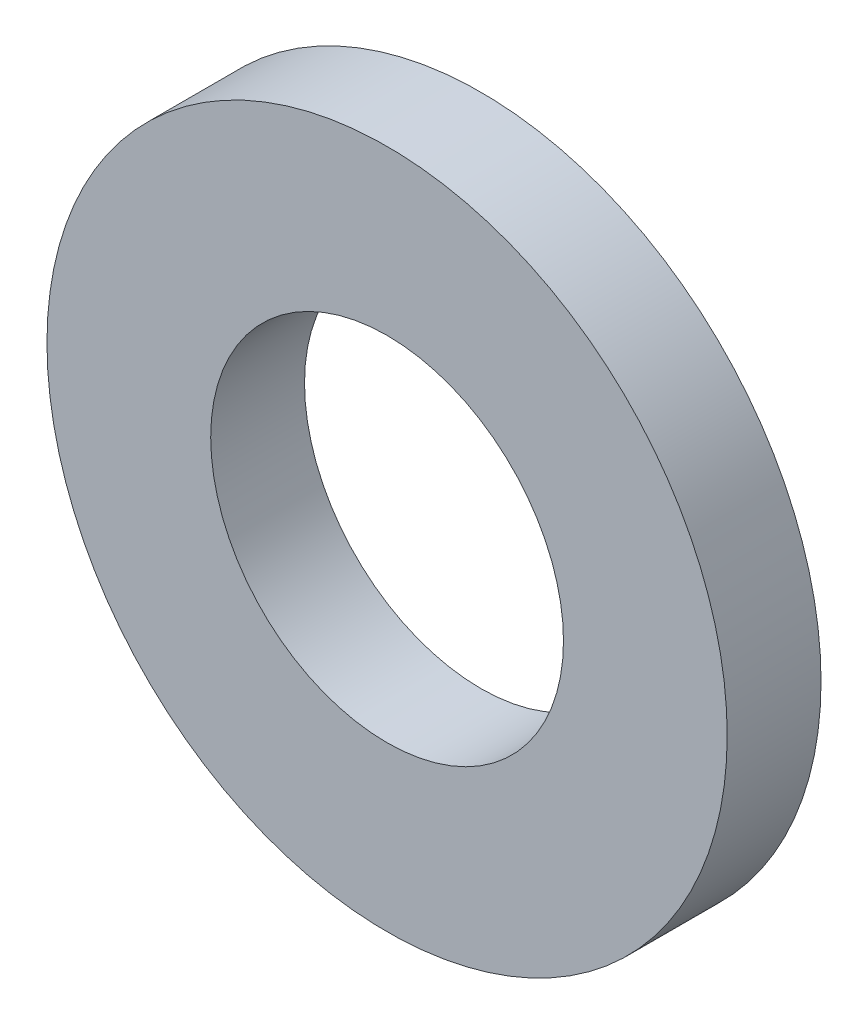
ISO-10303-21;
HEADER;
FILE_DESCRIPTION(('STEP AP214'),'2;1');
FILE_NAME('part.step','',(''),(''),'','','');
FILE_SCHEMA(('AUTOMOTIVE_DESIGN { 1 0 10303 214 1 1 1 1 }'));
ENDSEC;
DATA;
#1=APPLICATION_CONTEXT('core data for automotive mechanical design processes');
#2=APPLICATION_PROTOCOL_DEFINITION('international standard','automotive_design',2000,#1);
#3=PRODUCT_CONTEXT('',#1,'mechanical');
#4=PRODUCT('Part','Part','',(#3));
#5=PRODUCT_RELATED_PRODUCT_CATEGORY('part','',(#4));
#6=PRODUCT_DEFINITION_FORMATION('','',#4);
#7=PRODUCT_DEFINITION_CONTEXT('part definition',#1,'design');
#8=PRODUCT_DEFINITION('design','',#6,#7);
#9=PRODUCT_DEFINITION_SHAPE('','',#8);
#10=(LENGTH_UNIT() NAMED_UNIT(*) SI_UNIT(.MILLI.,.METRE.));
#11=(NAMED_UNIT(*) PLANE_ANGLE_UNIT() SI_UNIT($,.RADIAN.));
#12=(NAMED_UNIT(*) SI_UNIT($,.STERADIAN.) SOLID_ANGLE_UNIT());
#13=UNCERTAINTY_MEASURE_WITH_UNIT(LENGTH_MEASURE(1.E-05),#10,'distance_accuracy_value','');
#14=(GEOMETRIC_REPRESENTATION_CONTEXT(3) GLOBAL_UNCERTAINTY_ASSIGNED_CONTEXT((#13)) GLOBAL_UNIT_ASSIGNED_CONTEXT((#10,
#11,#12)) REPRESENTATION_CONTEXT('',''));
#15=CARTESIAN_POINT('',(0.,0.,0.));
#16=DIRECTION('',(0.,0.,1.));
#17=DIRECTION('',(1.,0.,0.));
#18=AXIS2_PLACEMENT_3D('',#15,#16,#17);
#19=CARTESIAN_POINT('',(0.,23.876,-12.7));
#20=DIRECTION('',(0.,0.,1.));
#21=DIRECTION('',(1.,0.,0.));
#22=AXIS2_PLACEMENT_3D('',#19,#20,#21);
#23=PLANE('',#22);
#24=CARTESIAN_POINT('',(0.,0.,-12.7));
#25=DIRECTION('',(0.,0.,1.));
#26=DIRECTION('',(1.,0.,0.));
#27=AXIS2_PLACEMENT_3D('',#24,#25,#26);
#28=CIRCLE('',#27,46.0375);
#29=CARTESIAN_POINT('',(46.0375,0.,-12.7));
#30=VERTEX_POINT('',#29);
#31=EDGE_CURVE('E46',#30,#30,#28,.T.);
#32=ORIENTED_EDGE('',*,*,#31,.F.);
#33=EDGE_LOOP('',(#32));
#34=FACE_BOUND('',#33,.T.);
#35=CARTESIAN_POINT('',(0.,0.,-12.7));
#36=DIRECTION('',(0.,0.,1.));
#37=DIRECTION('',(1.,0.,0.));
#38=AXIS2_PLACEMENT_3D('',#35,#36,#37);
#39=CIRCLE('',#38,23.876);
#40=CARTESIAN_POINT('',(23.876,0.,-12.7));
#41=VERTEX_POINT('',#40);
#42=EDGE_CURVE('E10',#41,#41,#39,.T.);
#43=ORIENTED_EDGE('',*,*,#42,.T.);
#44=EDGE_LOOP('',(#43));
#45=FACE_BOUND('',#44,.T.);
#46=ADVANCED_FACE('F32',(#34,#45),#23,.F.);
#47=CARTESIAN_POINT('',(0.,0.,0.));
#48=DIRECTION('',(0.,0.,1.));
#49=DIRECTION('',(1.,0.,0.));
#50=AXIS2_PLACEMENT_3D('',#47,#48,#49);
#51=CYLINDRICAL_SURFACE('',#50,23.876);
#52=ORIENTED_EDGE('',*,*,#42,.F.);
#53=EDGE_LOOP('',(#52));
#54=FACE_BOUND('',#53,.T.);
#55=CARTESIAN_POINT('',(0.,0.,0.));
#56=DIRECTION('',(0.,0.,1.));
#57=DIRECTION('',(1.,0.,0.));
#58=AXIS2_PLACEMENT_3D('',#55,#56,#57);
#59=CIRCLE('',#58,23.876);
#60=CARTESIAN_POINT('',(23.876,0.,0.));
#61=VERTEX_POINT('',#60);
#62=EDGE_CURVE('E38',#61,#61,#59,.T.);
#63=ORIENTED_EDGE('',*,*,#62,.T.);
#64=EDGE_LOOP('',(#63));
#65=FACE_BOUND('',#64,.T.);
#66=ADVANCED_FACE('F55',(#54,#65),#51,.F.);
#67=CARTESIAN_POINT('',(0.,23.876,0.));
#68=DIRECTION('',(0.,0.,-1.));
#69=DIRECTION('',(-1.,0.,0.));
#70=AXIS2_PLACEMENT_3D('',#67,#68,#69);
#71=PLANE('',#70);
#72=ORIENTED_EDGE('',*,*,#62,.F.);
#73=EDGE_LOOP('',(#72));
#74=FACE_BOUND('',#73,.T.);
#75=CARTESIAN_POINT('',(0.,0.,0.));
#76=DIRECTION('',(0.,0.,1.));
#77=DIRECTION('',(1.,0.,0.));
#78=AXIS2_PLACEMENT_3D('',#75,#76,#77);
#79=CIRCLE('',#78,46.0375);
#80=CARTESIAN_POINT('',(46.0375,0.,0.));
#81=VERTEX_POINT('',#80);
#82=EDGE_CURVE('E42',#81,#81,#79,.T.);
#83=ORIENTED_EDGE('',*,*,#82,.T.);
#84=EDGE_LOOP('',(#83));
#85=FACE_BOUND('',#84,.T.);
#86=ADVANCED_FACE('F59',(#74,#85),#71,.F.);
#87=CARTESIAN_POINT('',(0.,0.,0.));
#88=DIRECTION('',(0.,0.,1.));
#89=DIRECTION('',(1.,0.,0.));
#90=AXIS2_PLACEMENT_3D('',#87,#88,#89);
#91=CYLINDRICAL_SURFACE('',#90,46.0375);
#92=ORIENTED_EDGE('',*,*,#82,.F.);
#93=EDGE_LOOP('',(#92));
#94=FACE_BOUND('',#93,.T.);
#95=ORIENTED_EDGE('',*,*,#31,.T.);
#96=EDGE_LOOP('',(#95));
#97=FACE_BOUND('',#96,.T.);
#98=ADVANCED_FACE('F52',(#94,#97),#91,.T.);
#99=CLOSED_SHELL('',(#46,#66,#86,#98));
#100=MANIFOLD_SOLID_BREP('B2',#99);
#101=ADVANCED_BREP_SHAPE_REPRESENTATION('',(#18,#100),#14);
#102=SHAPE_DEFINITION_REPRESENTATION(#9,#101);
ENDSEC;
END-ISO-10303-21;
